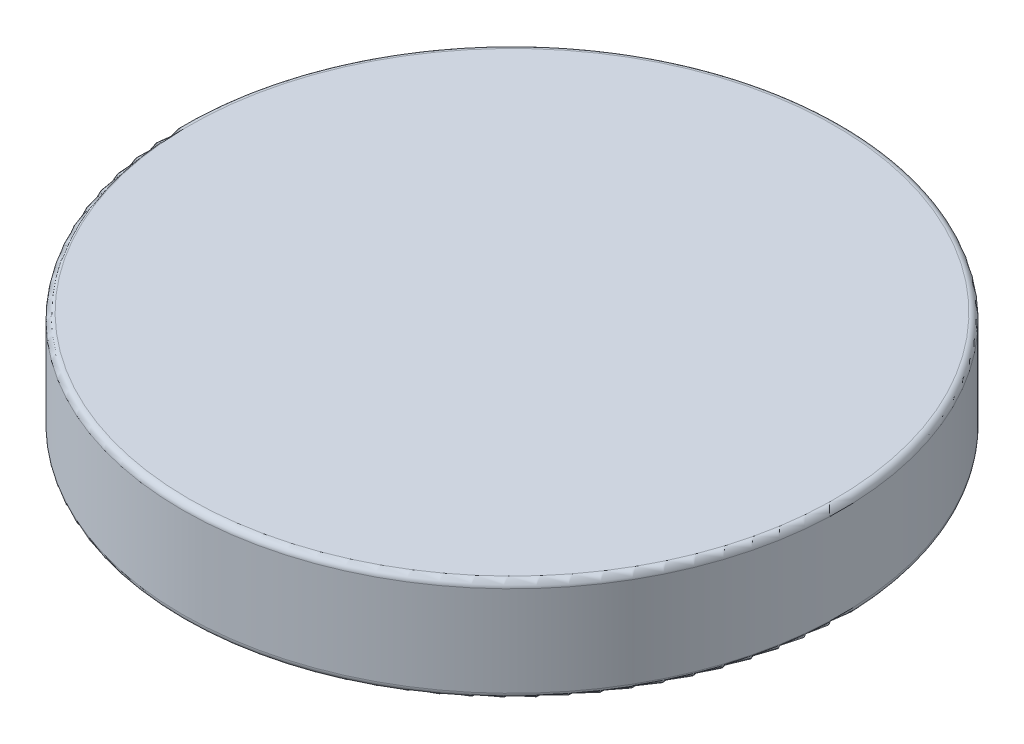
ISO-10303-21;
HEADER;
FILE_DESCRIPTION(('STEP AP214'),'2;1');
FILE_NAME('part.step','',(''),(''),'','','');
FILE_SCHEMA(('AUTOMOTIVE_DESIGN { 1 0 10303 214 1 1 1 1 }'));
ENDSEC;
DATA;
#1=APPLICATION_CONTEXT('core data for automotive mechanical design processes');
#2=APPLICATION_PROTOCOL_DEFINITION('international standard','automotive_design',2000,#1);
#3=PRODUCT_CONTEXT('',#1,'mechanical');
#4=PRODUCT('Part','Part','',(#3));
#5=PRODUCT_RELATED_PRODUCT_CATEGORY('part','',(#4));
#6=PRODUCT_DEFINITION_FORMATION('','',#4);
#7=PRODUCT_DEFINITION_CONTEXT('part definition',#1,'design');
#8=PRODUCT_DEFINITION('design','',#6,#7);
#9=PRODUCT_DEFINITION_SHAPE('','',#8);
#10=(LENGTH_UNIT() NAMED_UNIT(*) SI_UNIT(.MILLI.,.METRE.));
#11=(NAMED_UNIT(*) PLANE_ANGLE_UNIT() SI_UNIT($,.RADIAN.));
#12=(NAMED_UNIT(*) SI_UNIT($,.STERADIAN.) SOLID_ANGLE_UNIT());
#13=UNCERTAINTY_MEASURE_WITH_UNIT(LENGTH_MEASURE(1.E-05),#10,'distance_accuracy_value','');
#14=(GEOMETRIC_REPRESENTATION_CONTEXT(3) GLOBAL_UNCERTAINTY_ASSIGNED_CONTEXT((#13)) GLOBAL_UNIT_ASSIGNED_CONTEXT((#10,
#11,#12)) REPRESENTATION_CONTEXT('',''));
#15=CARTESIAN_POINT('',(0.,0.,0.));
#16=DIRECTION('',(0.,0.,1.));
#17=DIRECTION('',(1.,0.,0.));
#18=AXIS2_PLACEMENT_3D('',#15,#16,#17);
#19=CARTESIAN_POINT('',(0.,-20.32,0.));
#20=DIRECTION('',(0.,1.,0.));
#21=DIRECTION('',(0.,0.,1.));
#22=AXIS2_PLACEMENT_3D('',#19,#20,#21);
#23=CYLINDRICAL_SURFACE('',#22,64.77);
#24=CARTESIAN_POINT('',(0.,-19.05,0.));
#25=DIRECTION('',(0.,1.,0.));
#26=DIRECTION('',(0.,0.,1.));
#27=AXIS2_PLACEMENT_3D('',#24,#25,#26);
#28=CIRCLE('',#27,64.77);
#29=CARTESIAN_POINT('',(0.,-19.05,64.77));
#30=VERTEX_POINT('',#29);
#31=EDGE_CURVE('E44',#30,#30,#28,.T.);
#32=ORIENTED_EDGE('',*,*,#31,.T.);
#33=EDGE_LOOP('',(#32));
#34=FACE_BOUND('',#33,.T.);
#35=CARTESIAN_POINT('',(0.,-1.27,0.));
#36=DIRECTION('',(0.,1.,0.));
#37=DIRECTION('',(0.,0.,1.));
#38=AXIS2_PLACEMENT_3D('',#35,#36,#37);
#39=CIRCLE('',#38,64.77);
#40=CARTESIAN_POINT('',(0.,-1.27,64.77));
#41=VERTEX_POINT('',#40);
#42=EDGE_CURVE('E48',#41,#41,#39,.F.);
#43=ORIENTED_EDGE('',*,*,#42,.T.);
#44=EDGE_LOOP('',(#43));
#45=FACE_BOUND('',#44,.T.);
#46=ADVANCED_FACE('F33',(#34,#45),#23,.T.);
#47=CARTESIAN_POINT('',(0.,-20.32,0.));
#48=DIRECTION('',(0.,1.,0.));
#49=DIRECTION('',(0.,0.,1.));
#50=AXIS2_PLACEMENT_3D('',#47,#48,#49);
#51=PLANE('',#50);
#52=CARTESIAN_POINT('',(0.,-20.32,0.));
#53=DIRECTION('',(0.,1.,0.));
#54=DIRECTION('',(0.,0.,1.));
#55=AXIS2_PLACEMENT_3D('',#52,#53,#54);
#56=CIRCLE('',#55,63.5);
#57=CARTESIAN_POINT('',(0.,-20.32,63.5));
#58=VERTEX_POINT('',#57);
#59=EDGE_CURVE('E40',#58,#58,#56,.F.);
#60=ORIENTED_EDGE('',*,*,#59,.T.);
#61=EDGE_LOOP('',(#60));
#62=FACE_BOUND('',#61,.T.);
#63=ADVANCED_FACE('F64',(#62),#51,.F.);
#64=CARTESIAN_POINT('',(0.,0.,0.));
#65=DIRECTION('',(0.,1.,0.));
#66=DIRECTION('',(0.,0.,1.));
#67=AXIS2_PLACEMENT_3D('',#64,#65,#66);
#68=PLANE('',#67);
#69=CARTESIAN_POINT('',(0.,0.,0.));
#70=DIRECTION('',(0.,1.,0.));
#71=DIRECTION('',(0.,0.,1.));
#72=AXIS2_PLACEMENT_3D('',#69,#70,#71);
#73=CIRCLE('',#72,63.5);
#74=CARTESIAN_POINT('',(0.,0.,63.5));
#75=VERTEX_POINT('',#74);
#76=EDGE_CURVE('E10',#75,#75,#73,.T.);
#77=ORIENTED_EDGE('',*,*,#76,.T.);
#78=EDGE_LOOP('',(#77));
#79=FACE_BOUND('',#78,.T.);
#80=ADVANCED_FACE('F61',(#79),#68,.T.);
#81=CARTESIAN_POINT('',(0.,-19.05,0.));
#82=DIRECTION('',(0.,1.,0.));
#83=DIRECTION('',(0.,0.,1.));
#84=AXIS2_PLACEMENT_3D('',#81,#82,#83);
#85=TOROIDAL_SURFACE('',#84,63.5,1.27);
#86=ORIENTED_EDGE('',*,*,#59,.F.);
#87=EDGE_LOOP('',(#86));
#88=FACE_BOUND('',#87,.T.);
#89=ORIENTED_EDGE('',*,*,#31,.F.);
#90=EDGE_LOOP('',(#89));
#91=FACE_BOUND('',#90,.T.);
#92=ADVANCED_FACE('F57',(#88,#91),#85,.T.);
#93=CARTESIAN_POINT('',(0.,-1.27,0.));
#94=DIRECTION('',(0.,1.,0.));
#95=DIRECTION('',(0.,0.,1.));
#96=AXIS2_PLACEMENT_3D('',#93,#94,#95);
#97=TOROIDAL_SURFACE('',#96,63.5,1.27);
#98=ORIENTED_EDGE('',*,*,#42,.F.);
#99=EDGE_LOOP('',(#98));
#100=FACE_BOUND('',#99,.T.);
#101=ORIENTED_EDGE('',*,*,#76,.F.);
#102=EDGE_LOOP('',(#101));
#103=FACE_BOUND('',#102,.T.);
#104=ADVANCED_FACE('F35',(#100,#103),#97,.T.);
#105=CLOSED_SHELL('',(#46,#63,#80,#92,#104));
#106=MANIFOLD_SOLID_BREP('B2',#105);
#107=ADVANCED_BREP_SHAPE_REPRESENTATION('',(#18,#106),#14);
#108=SHAPE_DEFINITION_REPRESENTATION(#9,#107);
ENDSEC;
END-ISO-10303-21;
